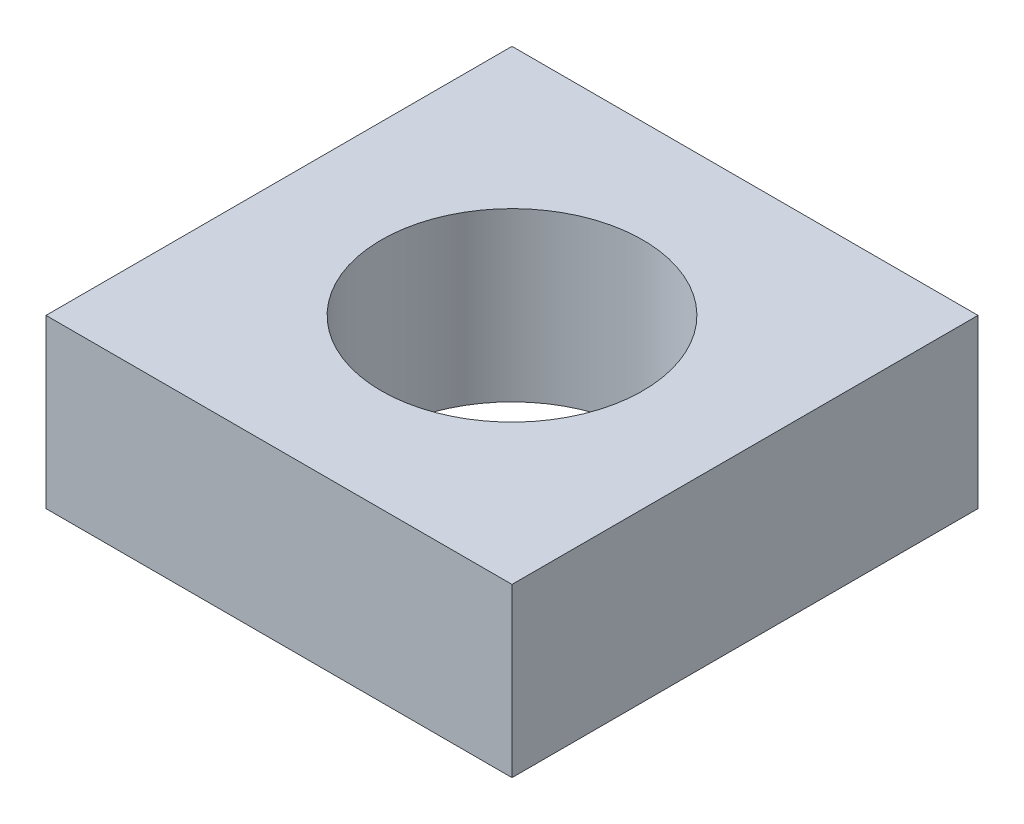
ISO-10303-21;
HEADER;
FILE_DESCRIPTION(('STEP AP214'),'2;1');
FILE_NAME('part.step','',(''),(''),'','','');
FILE_SCHEMA(('AUTOMOTIVE_DESIGN { 1 0 10303 214 1 1 1 1 }'));
ENDSEC;
DATA;
#1=APPLICATION_CONTEXT('core data for automotive mechanical design processes');
#2=APPLICATION_PROTOCOL_DEFINITION('international standard','automotive_design',2000,#1);
#3=PRODUCT_CONTEXT('',#1,'mechanical');
#4=PRODUCT('Part','Part','',(#3));
#5=PRODUCT_RELATED_PRODUCT_CATEGORY('part','',(#4));
#6=PRODUCT_DEFINITION_FORMATION('','',#4);
#7=PRODUCT_DEFINITION_CONTEXT('part definition',#1,'design');
#8=PRODUCT_DEFINITION('design','',#6,#7);
#9=PRODUCT_DEFINITION_SHAPE('','',#8);
#10=(LENGTH_UNIT() NAMED_UNIT(*) SI_UNIT(.MILLI.,.METRE.));
#11=(NAMED_UNIT(*) PLANE_ANGLE_UNIT() SI_UNIT($,.RADIAN.));
#12=(NAMED_UNIT(*) SI_UNIT($,.STERADIAN.) SOLID_ANGLE_UNIT());
#13=UNCERTAINTY_MEASURE_WITH_UNIT(LENGTH_MEASURE(1.E-05),#10,'distance_accuracy_value','');
#14=(GEOMETRIC_REPRESENTATION_CONTEXT(3) GLOBAL_UNCERTAINTY_ASSIGNED_CONTEXT((#13)) GLOBAL_UNIT_ASSIGNED_CONTEXT((#10,
#11,#12)) REPRESENTATION_CONTEXT('',''));
#15=CARTESIAN_POINT('',(0.,0.,0.));
#16=DIRECTION('',(0.,0.,1.));
#17=DIRECTION('',(1.,0.,0.));
#18=AXIS2_PLACEMENT_3D('',#15,#16,#17);
#19=CARTESIAN_POINT('',(0.,1.6,0.));
#20=DIRECTION('',(0.,-1.,0.));
#21=DIRECTION('',(0.,0.,-1.));
#22=AXIS2_PLACEMENT_3D('',#19,#20,#21);
#23=PLANE('',#22);
#24=DIRECTION('',(0.,0.,1.));
#25=VECTOR('',#24,1.);
#26=CARTESIAN_POINT('',(0.,1.6,0.));
#27=LINE('',#26,#25);
#28=CARTESIAN_POINT('',(0.,1.6,-4.45477272147525));
#29=VERTEX_POINT('',#28);
#30=CARTESIAN_POINT('',(0.,1.6,0.));
#31=VERTEX_POINT('',#30);
#32=EDGE_CURVE('E100',#29,#31,#27,.T.);
#33=ORIENTED_EDGE('',*,*,#32,.T.);
#34=DIRECTION('',(1.,0.,0.));
#35=VECTOR('',#34,1.);
#36=CARTESIAN_POINT('',(0.,1.6,0.));
#37=LINE('',#36,#35);
#38=CARTESIAN_POINT('',(4.45477272147525,1.6,0.));
#39=VERTEX_POINT('',#38);
#40=EDGE_CURVE('E95',#31,#39,#37,.T.);
#41=ORIENTED_EDGE('',*,*,#40,.T.);
#42=DIRECTION('',(0.,0.,-1.));
#43=VECTOR('',#42,1.);
#44=CARTESIAN_POINT('',(4.45477272147525,1.6,0.));
#45=LINE('',#44,#43);
#46=CARTESIAN_POINT('',(4.45477272147525,1.6,-4.45477272147525));
#47=VERTEX_POINT('',#46);
#48=EDGE_CURVE('E98',#39,#47,#45,.T.);
#49=ORIENTED_EDGE('',*,*,#48,.T.);
#50=DIRECTION('',(-1.,0.,0.));
#51=VECTOR('',#50,1.);
#52=CARTESIAN_POINT('',(0.,1.6,-4.45477272147525));
#53=LINE('',#52,#51);
#54=EDGE_CURVE('E65',#47,#29,#53,.T.);
#55=ORIENTED_EDGE('',*,*,#54,.T.);
#56=EDGE_LOOP('',(#33,#41,#49,#55));
#57=FACE_BOUND('',#56,.T.);
#58=CARTESIAN_POINT('',(2.22738636073762,1.6,-2.22738636073762));
#59=DIRECTION('',(0.,1.,0.));
#60=DIRECTION('',(0.,0.,1.));
#61=AXIS2_PLACEMENT_3D('',#58,#59,#60);
#62=CIRCLE('',#61,1.25);
#63=CARTESIAN_POINT('',(2.22738636073762,1.6,-0.977386360737623));
#64=VERTEX_POINT('',#63);
#65=EDGE_CURVE('E120',#64,#64,#62,.T.);
#66=ORIENTED_EDGE('',*,*,#65,.F.);
#67=EDGE_LOOP('',(#66));
#68=FACE_BOUND('',#67,.T.);
#69=ADVANCED_FACE('F47',(#57,#68),#23,.F.);
#70=CARTESIAN_POINT('',(0.,0.,0.));
#71=DIRECTION('',(0.,-1.,0.));
#72=DIRECTION('',(0.,0.,-1.));
#73=AXIS2_PLACEMENT_3D('',#70,#71,#72);
#74=PLANE('',#73);
#75=DIRECTION('',(0.,0.,1.));
#76=VECTOR('',#75,1.);
#77=CARTESIAN_POINT('',(0.,0.,0.));
#78=LINE('',#77,#76);
#79=CARTESIAN_POINT('',(0.,0.,-4.45477272147525));
#80=VERTEX_POINT('',#79);
#81=CARTESIAN_POINT('',(0.,0.,0.));
#82=VERTEX_POINT('',#81);
#83=EDGE_CURVE('E116',#80,#82,#78,.T.);
#84=ORIENTED_EDGE('',*,*,#83,.F.);
#85=DIRECTION('',(-1.,0.,0.));
#86=VECTOR('',#85,1.);
#87=CARTESIAN_POINT('',(0.,0.,-4.45477272147525));
#88=LINE('',#87,#86);
#89=CARTESIAN_POINT('',(4.45477272147525,0.,-4.45477272147525));
#90=VERTEX_POINT('',#89);
#91=EDGE_CURVE('E88',#90,#80,#88,.T.);
#92=ORIENTED_EDGE('',*,*,#91,.F.);
#93=DIRECTION('',(0.,0.,-1.));
#94=VECTOR('',#93,1.);
#95=CARTESIAN_POINT('',(4.45477272147525,0.,0.));
#96=LINE('',#95,#94);
#97=CARTESIAN_POINT('',(4.45477272147525,0.,0.));
#98=VERTEX_POINT('',#97);
#99=EDGE_CURVE('E82',#98,#90,#96,.T.);
#100=ORIENTED_EDGE('',*,*,#99,.F.);
#101=DIRECTION('',(1.,0.,0.));
#102=VECTOR('',#101,1.);
#103=CARTESIAN_POINT('',(0.,0.,0.));
#104=LINE('',#103,#102);
#105=EDGE_CURVE('E105',#82,#98,#104,.T.);
#106=ORIENTED_EDGE('',*,*,#105,.F.);
#107=EDGE_LOOP('',(#84,#92,#100,#106));
#108=FACE_BOUND('',#107,.T.);
#109=CARTESIAN_POINT('',(2.22738636073762,0.,-2.22738636073762));
#110=DIRECTION('',(0.,1.,0.));
#111=DIRECTION('',(0.,0.,1.));
#112=AXIS2_PLACEMENT_3D('',#109,#110,#111);
#113=CIRCLE('',#112,1.25);
#114=CARTESIAN_POINT('',(2.22738636073762,0.,-0.977386360737623));
#115=VERTEX_POINT('',#114);
#116=EDGE_CURVE('E138',#115,#115,#113,.T.);
#117=ORIENTED_EDGE('',*,*,#116,.T.);
#118=EDGE_LOOP('',(#117));
#119=FACE_BOUND('',#118,.T.);
#120=ADVANCED_FACE('F133',(#108,#119),#74,.T.);
#121=CARTESIAN_POINT('',(0.,1.6,0.));
#122=DIRECTION('',(1.,0.,0.));
#123=DIRECTION('',(0.,0.,-1.));
#124=AXIS2_PLACEMENT_3D('',#121,#122,#123);
#125=PLANE('',#124);
#126=ORIENTED_EDGE('',*,*,#83,.T.);
#127=DIRECTION('',(0.,-1.,0.));
#128=VECTOR('',#127,1.);
#129=CARTESIAN_POINT('',(0.,1.6,0.));
#130=LINE('',#129,#128);
#131=EDGE_CURVE('E11',#31,#82,#130,.T.);
#132=ORIENTED_EDGE('',*,*,#131,.F.);
#133=ORIENTED_EDGE('',*,*,#32,.F.);
#134=DIRECTION('',(0.,-1.,0.));
#135=VECTOR('',#134,1.);
#136=CARTESIAN_POINT('',(0.,1.6,-4.45477272147525));
#137=LINE('',#136,#135);
#138=EDGE_CURVE('E112',#29,#80,#137,.T.);
#139=ORIENTED_EDGE('',*,*,#138,.T.);
#140=EDGE_LOOP('',(#126,#132,#133,#139));
#141=FACE_BOUND('',#140,.T.);
#142=ADVANCED_FACE('F49',(#141),#125,.F.);
#143=CARTESIAN_POINT('',(0.,1.6,0.));
#144=DIRECTION('',(0.,0.,-1.));
#145=DIRECTION('',(-1.,0.,0.));
#146=AXIS2_PLACEMENT_3D('',#143,#144,#145);
#147=PLANE('',#146);
#148=ORIENTED_EDGE('',*,*,#105,.T.);
#149=DIRECTION('',(0.,-1.,0.));
#150=VECTOR('',#149,1.);
#151=CARTESIAN_POINT('',(4.45477272147525,1.6,0.));
#152=LINE('',#151,#150);
#153=EDGE_CURVE('E57',#39,#98,#152,.T.);
#154=ORIENTED_EDGE('',*,*,#153,.F.);
#155=ORIENTED_EDGE('',*,*,#40,.F.);
#156=ORIENTED_EDGE('',*,*,#131,.T.);
#157=EDGE_LOOP('',(#148,#154,#155,#156));
#158=FACE_BOUND('',#157,.T.);
#159=ADVANCED_FACE('F104',(#158),#147,.F.);
#160=CARTESIAN_POINT('',(4.45477272147525,1.6,0.));
#161=DIRECTION('',(-1.,0.,0.));
#162=DIRECTION('',(0.,0.,1.));
#163=AXIS2_PLACEMENT_3D('',#160,#161,#162);
#164=PLANE('',#163);
#165=ORIENTED_EDGE('',*,*,#99,.T.);
#166=DIRECTION('',(0.,-1.,0.));
#167=VECTOR('',#166,1.);
#168=CARTESIAN_POINT('',(4.45477272147525,1.6,-4.45477272147525));
#169=LINE('',#168,#167);
#170=EDGE_CURVE('E107',#47,#90,#169,.T.);
#171=ORIENTED_EDGE('',*,*,#170,.F.);
#172=ORIENTED_EDGE('',*,*,#48,.F.);
#173=ORIENTED_EDGE('',*,*,#153,.T.);
#174=EDGE_LOOP('',(#165,#171,#172,#173));
#175=FACE_BOUND('',#174,.T.);
#176=ADVANCED_FACE('F108',(#175),#164,.F.);
#177=CARTESIAN_POINT('',(0.,1.6,-4.45477272147525));
#178=DIRECTION('',(0.,0.,1.));
#179=DIRECTION('',(1.,0.,0.));
#180=AXIS2_PLACEMENT_3D('',#177,#178,#179);
#181=PLANE('',#180);
#182=ORIENTED_EDGE('',*,*,#91,.T.);
#183=ORIENTED_EDGE('',*,*,#138,.F.);
#184=ORIENTED_EDGE('',*,*,#54,.F.);
#185=ORIENTED_EDGE('',*,*,#170,.T.);
#186=EDGE_LOOP('',(#182,#183,#184,#185));
#187=FACE_BOUND('',#186,.T.);
#188=ADVANCED_FACE('F130',(#187),#181,.F.);
#189=CARTESIAN_POINT('',(2.22738636073762,1.6,-2.22738636073762));
#190=DIRECTION('',(0.,-1.,0.));
#191=DIRECTION('',(0.,0.,-1.));
#192=AXIS2_PLACEMENT_3D('',#189,#190,#191);
#193=CYLINDRICAL_SURFACE('',#192,1.25);
#194=ORIENTED_EDGE('',*,*,#65,.T.);
#195=EDGE_LOOP('',(#194));
#196=FACE_BOUND('',#195,.T.);
#197=ORIENTED_EDGE('',*,*,#116,.F.);
#198=EDGE_LOOP('',(#197));
#199=FACE_BOUND('',#198,.T.);
#200=ADVANCED_FACE('F146',(#196,#199),#193,.F.);
#201=CLOSED_SHELL('',(#69,#120,#142,#159,#176,#188,#200));
#202=MANIFOLD_SOLID_BREP('B2',#201);
#203=ADVANCED_BREP_SHAPE_REPRESENTATION('',(#18,#202),#14);
#204=SHAPE_DEFINITION_REPRESENTATION(#9,#203);
ENDSEC;
END-ISO-10303-21;
